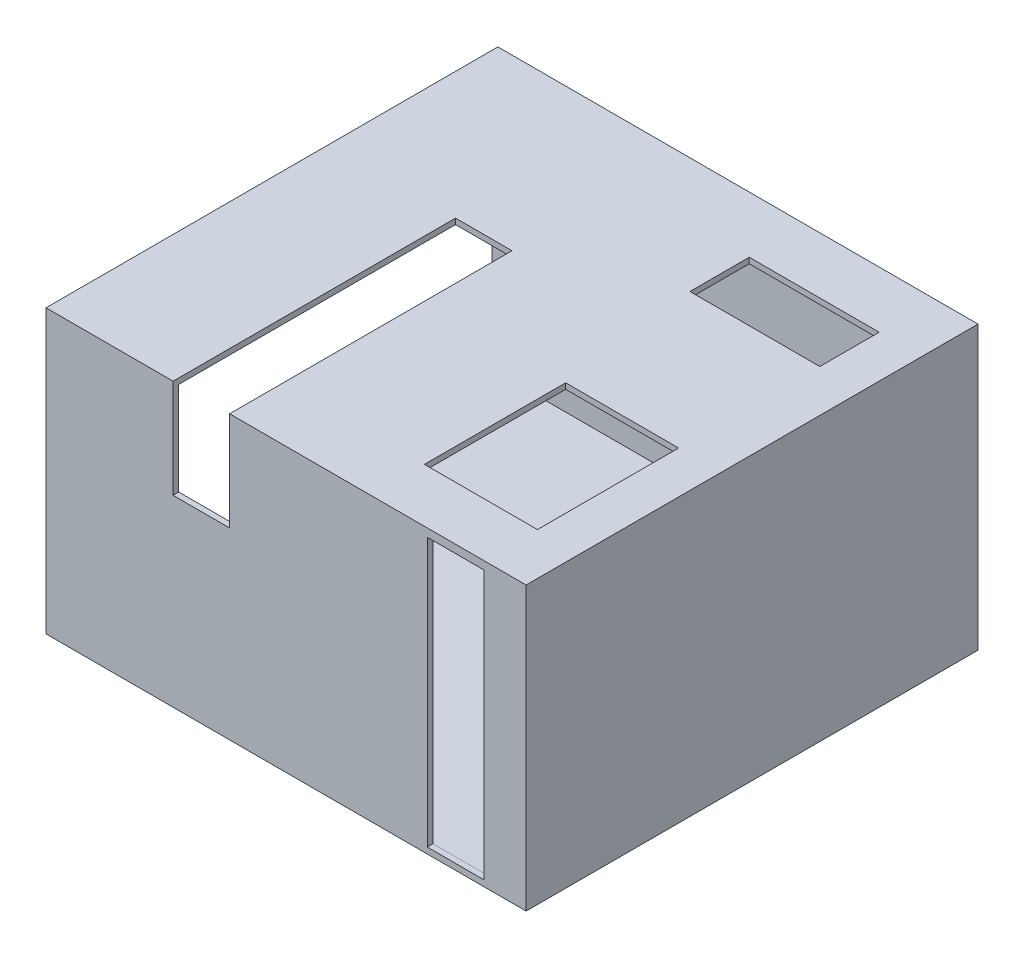
ISO-10303-21;
HEADER;
FILE_DESCRIPTION(('STEP AP214'),'2;1');
FILE_NAME('part.step','',(''),(''),'','','');
FILE_SCHEMA(('AUTOMOTIVE_DESIGN { 1 0 10303 214 1 1 1 1 }'));
ENDSEC;
DATA;
#1=APPLICATION_CONTEXT('core data for automotive mechanical design processes');
#2=APPLICATION_PROTOCOL_DEFINITION('international standard','automotive_design',2000,#1);
#3=PRODUCT_CONTEXT('',#1,'mechanical');
#4=PRODUCT('Part','Part','',(#3));
#5=PRODUCT_RELATED_PRODUCT_CATEGORY('part','',(#4));
#6=PRODUCT_DEFINITION_FORMATION('','',#4);
#7=PRODUCT_DEFINITION_CONTEXT('part definition',#1,'design');
#8=PRODUCT_DEFINITION('design','',#6,#7);
#9=PRODUCT_DEFINITION_SHAPE('','',#8);
#10=(LENGTH_UNIT() NAMED_UNIT(*) SI_UNIT(.MILLI.,.METRE.));
#11=(NAMED_UNIT(*) PLANE_ANGLE_UNIT() SI_UNIT($,.RADIAN.));
#12=(NAMED_UNIT(*) SI_UNIT($,.STERADIAN.) SOLID_ANGLE_UNIT());
#13=UNCERTAINTY_MEASURE_WITH_UNIT(LENGTH_MEASURE(1.E-05),#10,'distance_accuracy_value','');
#14=(GEOMETRIC_REPRESENTATION_CONTEXT(3) GLOBAL_UNCERTAINTY_ASSIGNED_CONTEXT((#13)) GLOBAL_UNIT_ASSIGNED_CONTEXT((#10,
#11,#12)) REPRESENTATION_CONTEXT('',''));
#15=CARTESIAN_POINT('',(0.,0.,0.));
#16=DIRECTION('',(0.,0.,1.));
#17=DIRECTION('',(1.,0.,0.));
#18=AXIS2_PLACEMENT_3D('',#15,#16,#17);
#19=CARTESIAN_POINT('',(132.679929783499,32.3434757167935,160.));
#20=DIRECTION('',(0.,-1.,0.));
#21=DIRECTION('',(1.,0.,0.));
#22=AXIS2_PLACEMENT_3D('',#19,#20,#21);
#23=PLANE('',#22);
#24=DIRECTION('',(1.,0.,0.));
#25=VECTOR('',#24,1.);
#26=CARTESIAN_POINT('',(77.6799297834991,32.3434757167935,141.));
#27=LINE('',#26,#25);
#28=CARTESIAN_POINT('',(77.6799297834991,32.3434757167935,141.));
#29=VERTEX_POINT('',#28);
#30=CARTESIAN_POINT('',(117.679929783499,32.3434757167935,141.));
#31=VERTEX_POINT('',#30);
#32=EDGE_CURVE('E452',#29,#31,#27,.T.);
#33=ORIENTED_EDGE('',*,*,#32,.F.);
#34=DIRECTION('',(0.,0.,1.));
#35=VECTOR('',#34,1.);
#36=CARTESIAN_POINT('',(77.6799297834991,32.3434757167935,91.));
#37=LINE('',#36,#35);
#38=CARTESIAN_POINT('',(77.6799297834991,32.3434757167935,91.));
#39=VERTEX_POINT('',#38);
#40=EDGE_CURVE('E408',#39,#29,#37,.T.);
#41=ORIENTED_EDGE('',*,*,#40,.F.);
#42=DIRECTION('',(-1.,0.,0.));
#43=VECTOR('',#42,1.);
#44=CARTESIAN_POINT('',(77.6799297834991,32.3434757167935,91.));
#45=LINE('',#44,#43);
#46=CARTESIAN_POINT('',(117.679929783499,32.3434757167935,91.));
#47=VERTEX_POINT('',#46);
#48=EDGE_CURVE('E436',#47,#39,#45,.T.);
#49=ORIENTED_EDGE('',*,*,#48,.F.);
#50=DIRECTION('',(0.,0.,-1.));
#51=VECTOR('',#50,1.);
#52=CARTESIAN_POINT('',(117.679929783499,32.3434757167935,91.));
#53=LINE('',#52,#51);
#54=EDGE_CURVE('E448',#31,#47,#53,.T.);
#55=ORIENTED_EDGE('',*,*,#54,.F.);
#56=EDGE_LOOP('',(#33,#41,#49,#55));
#57=FACE_BOUND('',#56,.T.);
#58=DIRECTION('',(1.,0.,0.));
#59=VECTOR('',#58,1.);
#60=CARTESIAN_POINT('',(71.6799297834991,32.3434757167935,41.));
#61=LINE('',#60,#59);
#62=CARTESIAN_POINT('',(71.6799297834991,32.3434757167935,41.));
#63=VERTEX_POINT('',#62);
#64=CARTESIAN_POINT('',(117.679929783499,32.3434757167935,41.));
#65=VERTEX_POINT('',#64);
#66=EDGE_CURVE('E407',#63,#65,#61,.T.);
#67=ORIENTED_EDGE('',*,*,#66,.F.);
#68=DIRECTION('',(0.,0.,1.));
#69=VECTOR('',#68,1.);
#70=CARTESIAN_POINT('',(71.6799297834991,32.3434757167935,20.));
#71=LINE('',#70,#69);
#72=CARTESIAN_POINT('',(71.6799297834991,32.3434757167935,20.));
#73=VERTEX_POINT('',#72);
#74=EDGE_CURVE('E404',#73,#63,#71,.T.);
#75=ORIENTED_EDGE('',*,*,#74,.F.);
#76=DIRECTION('',(-1.,0.,0.));
#77=VECTOR('',#76,1.);
#78=CARTESIAN_POINT('',(71.6799297834991,32.3434757167935,20.));
#79=LINE('',#78,#77);
#80=CARTESIAN_POINT('',(117.679929783499,32.3434757167935,20.));
#81=VERTEX_POINT('',#80);
#82=EDGE_CURVE('E416',#81,#73,#79,.T.);
#83=ORIENTED_EDGE('',*,*,#82,.F.);
#84=DIRECTION('',(0.,0.,-1.));
#85=VECTOR('',#84,1.);
#86=CARTESIAN_POINT('',(117.679929783499,32.3434757167935,20.));
#87=LINE('',#86,#85);
#88=EDGE_CURVE('E412',#65,#81,#87,.T.);
#89=ORIENTED_EDGE('',*,*,#88,.F.);
#90=EDGE_LOOP('',(#67,#75,#83,#89));
#91=FACE_BOUND('',#90,.T.);
#92=DIRECTION('',(0.,0.,-1.));
#93=VECTOR('',#92,1.);
#94=CARTESIAN_POINT('',(-37.320070216501,32.3434757167934,160.));
#95=LINE('',#94,#93);
#96=CARTESIAN_POINT('',(-37.320070216501,32.3434757167934,160.));
#97=VERTEX_POINT('',#96);
#98=CARTESIAN_POINT('',(-37.320070216501,32.3434757167934,0.));
#99=VERTEX_POINT('',#98);
#100=EDGE_CURVE('E62',#97,#99,#95,.T.);
#101=ORIENTED_EDGE('',*,*,#100,.F.);
#102=DIRECTION('',(-1.,0.,0.));
#103=VECTOR('',#102,1.);
#104=CARTESIAN_POINT('',(132.679929783499,32.3434757167935,160.));
#105=LINE('',#104,#103);
#106=CARTESIAN_POINT('',(7.67992978349914,32.3434757167935,160.));
#107=VERTEX_POINT('',#106);
#108=EDGE_CURVE('E263',#107,#97,#105,.T.);
#109=ORIENTED_EDGE('',*,*,#108,.F.);
#110=DIRECTION('',(0.,0.,1.));
#111=VECTOR('',#110,1.);
#112=CARTESIAN_POINT('',(7.67992978349913,32.3434757167935,60.));
#113=LINE('',#112,#111);
#114=CARTESIAN_POINT('',(7.67992978349913,32.3434757167935,60.));
#115=VERTEX_POINT('',#114);
#116=EDGE_CURVE('E479',#115,#107,#113,.T.);
#117=ORIENTED_EDGE('',*,*,#116,.F.);
#118=DIRECTION('',(-1.,0.,0.));
#119=VECTOR('',#118,1.);
#120=CARTESIAN_POINT('',(7.67992978349913,32.3434757167935,60.));
#121=LINE('',#120,#119);
#122=CARTESIAN_POINT('',(27.6799297834991,32.3434757167935,60.));
#123=VERTEX_POINT('',#122);
#124=EDGE_CURVE('E495',#123,#115,#121,.T.);
#125=ORIENTED_EDGE('',*,*,#124,.F.);
#126=DIRECTION('',(0.,0.,-1.));
#127=VECTOR('',#126,1.);
#128=CARTESIAN_POINT('',(27.6799297834991,32.3434757167935,60.));
#129=LINE('',#128,#127);
#130=CARTESIAN_POINT('',(27.6799297834991,32.3434757167935,160.));
#131=VERTEX_POINT('',#130);
#132=EDGE_CURVE('E359',#131,#123,#129,.T.);
#133=ORIENTED_EDGE('',*,*,#132,.F.);
#134=CARTESIAN_POINT('',(132.679929783499,32.3434757167935,160.));
#135=VERTEX_POINT('',#134);
#136=EDGE_CURVE('E265',#135,#131,#105,.T.);
#137=ORIENTED_EDGE('',*,*,#136,.F.);
#138=DIRECTION('',(0.,0.,-1.));
#139=VECTOR('',#138,1.);
#140=CARTESIAN_POINT('',(132.679929783499,32.3434757167935,160.));
#141=LINE('',#140,#139);
#142=CARTESIAN_POINT('',(132.679929783499,32.3434757167935,0.));
#143=VERTEX_POINT('',#142);
#144=EDGE_CURVE('E287',#135,#143,#141,.T.);
#145=ORIENTED_EDGE('',*,*,#144,.T.);
#146=DIRECTION('',(-1.,0.,0.));
#147=VECTOR('',#146,1.);
#148=CARTESIAN_POINT('',(132.679929783499,32.3434757167935,0.));
#149=LINE('',#148,#147);
#150=EDGE_CURVE('E277',#143,#99,#149,.T.);
#151=ORIENTED_EDGE('',*,*,#150,.T.);
#152=EDGE_LOOP('',(#101,#109,#117,#125,#133,#137,#145,#151));
#153=FACE_BOUND('',#152,.T.);
#154=ADVANCED_FACE('F46',(#57,#91,#153),#23,.F.);
#155=CARTESIAN_POINT('',(132.679929783499,-67.6565242832065,160.));
#156=DIRECTION('',(0.,1.,0.));
#157=DIRECTION('',(-1.,0.,0.));
#158=AXIS2_PLACEMENT_3D('',#155,#156,#157);
#159=PLANE('',#158);
#160=DIRECTION('',(0.,0.,1.));
#161=VECTOR('',#160,1.);
#162=CARTESIAN_POINT('',(-37.320070216501,-67.6565242832066,160.));
#163=LINE('',#162,#161);
#164=CARTESIAN_POINT('',(-37.320070216501,-67.6565242832066,0.));
#165=VERTEX_POINT('',#164);
#166=CARTESIAN_POINT('',(-37.320070216501,-67.6565242832066,160.));
#167=VERTEX_POINT('',#166);
#168=EDGE_CURVE('E481',#165,#167,#163,.T.);
#169=ORIENTED_EDGE('',*,*,#168,.F.);
#170=DIRECTION('',(1.,0.,0.));
#171=VECTOR('',#170,1.);
#172=CARTESIAN_POINT('',(132.679929783499,-67.6565242832065,0.));
#173=LINE('',#172,#171);
#174=CARTESIAN_POINT('',(132.679929783499,-67.6565242832065,0.));
#175=VERTEX_POINT('',#174);
#176=EDGE_CURVE('E264',#165,#175,#173,.T.);
#177=ORIENTED_EDGE('',*,*,#176,.T.);
#178=DIRECTION('',(0.,0.,-1.));
#179=VECTOR('',#178,1.);
#180=CARTESIAN_POINT('',(132.679929783499,-67.6565242832065,160.));
#181=LINE('',#180,#179);
#182=CARTESIAN_POINT('',(132.679929783499,-67.6565242832065,160.));
#183=VERTEX_POINT('',#182);
#184=EDGE_CURVE('E272',#183,#175,#181,.T.);
#185=ORIENTED_EDGE('',*,*,#184,.F.);
#186=DIRECTION('',(1.,0.,0.));
#187=VECTOR('',#186,1.);
#188=CARTESIAN_POINT('',(132.679929783499,-67.6565242832065,160.));
#189=LINE('',#188,#187);
#190=EDGE_CURVE('E269',#167,#183,#189,.T.);
#191=ORIENTED_EDGE('',*,*,#190,.F.);
#192=EDGE_LOOP('',(#169,#177,#185,#191));
#193=FACE_BOUND('',#192,.T.);
#194=ADVANCED_FACE('F547',(#193),#159,.F.);
#195=CARTESIAN_POINT('',(0.,0.,160.));
#196=DIRECTION('',(0.,0.,1.));
#197=DIRECTION('',(1.,0.,0.));
#198=AXIS2_PLACEMENT_3D('',#195,#196,#197);
#199=PLANE('',#198);
#200=DIRECTION('',(0.,-1.,0.));
#201=VECTOR('',#200,1.);
#202=CARTESIAN_POINT('',(97.6799297834991,29.4878306482134,160.));
#203=LINE('',#202,#201);
#204=CARTESIAN_POINT('',(97.6799297834991,29.4878306482134,160.));
#205=VERTEX_POINT('',#204);
#206=CARTESIAN_POINT('',(97.6799297834991,-65.5121693517866,160.));
#207=VERTEX_POINT('',#206);
#208=EDGE_CURVE('E369',#205,#207,#203,.T.);
#209=ORIENTED_EDGE('',*,*,#208,.F.);
#210=DIRECTION('',(-1.,0.,0.));
#211=VECTOR('',#210,1.);
#212=CARTESIAN_POINT('',(97.6799297834991,29.4878306482134,160.));
#213=LINE('',#212,#211);
#214=CARTESIAN_POINT('',(117.679929783499,29.4878306482134,160.));
#215=VERTEX_POINT('',#214);
#216=EDGE_CURVE('E386',#215,#205,#213,.T.);
#217=ORIENTED_EDGE('',*,*,#216,.F.);
#218=DIRECTION('',(0.,1.,0.));
#219=VECTOR('',#218,1.);
#220=CARTESIAN_POINT('',(117.679929783499,29.4878306482134,160.));
#221=LINE('',#220,#219);
#222=CARTESIAN_POINT('',(117.679929783499,-65.5121693517866,160.));
#223=VERTEX_POINT('',#222);
#224=EDGE_CURVE('E382',#223,#215,#221,.T.);
#225=ORIENTED_EDGE('',*,*,#224,.F.);
#226=DIRECTION('',(1.,0.,0.));
#227=VECTOR('',#226,1.);
#228=CARTESIAN_POINT('',(97.6799297834991,-65.5121693517866,160.));
#229=LINE('',#228,#227);
#230=EDGE_CURVE('E378',#207,#223,#229,.T.);
#231=ORIENTED_EDGE('',*,*,#230,.F.);
#232=EDGE_LOOP('',(#209,#217,#225,#231));
#233=FACE_BOUND('',#232,.T.);
#234=ORIENTED_EDGE('',*,*,#108,.T.);
#235=DIRECTION('',(0.,-1.,0.));
#236=VECTOR('',#235,1.);
#237=CARTESIAN_POINT('',(-37.320070216501,0.,160.));
#238=LINE('',#237,#236);
#239=EDGE_CURVE('E474',#97,#167,#238,.T.);
#240=ORIENTED_EDGE('',*,*,#239,.T.);
#241=ORIENTED_EDGE('',*,*,#190,.T.);
#242=DIRECTION('',(0.,1.,0.));
#243=VECTOR('',#242,1.);
#244=CARTESIAN_POINT('',(132.679929783499,-67.6565242832065,160.));
#245=LINE('',#244,#243);
#246=EDGE_CURVE('E259',#183,#135,#245,.T.);
#247=ORIENTED_EDGE('',*,*,#246,.T.);
#248=ORIENTED_EDGE('',*,*,#136,.T.);
#249=DIRECTION('',(0.,1.,0.));
#250=VECTOR('',#249,1.);
#251=CARTESIAN_POINT('',(27.6799297834991,-2.65652428320655,160.));
#252=LINE('',#251,#250);
#253=CARTESIAN_POINT('',(27.6799297834991,-2.65652428320655,160.));
#254=VERTEX_POINT('',#253);
#255=EDGE_CURVE('E362',#254,#131,#252,.T.);
#256=ORIENTED_EDGE('',*,*,#255,.F.);
#257=DIRECTION('',(1.,0.,0.));
#258=VECTOR('',#257,1.);
#259=CARTESIAN_POINT('',(7.67992978349914,-2.65652428320655,160.));
#260=LINE('',#259,#258);
#261=CARTESIAN_POINT('',(7.67992978349913,-2.65652428320655,160.));
#262=VERTEX_POINT('',#261);
#263=EDGE_CURVE('E494',#262,#254,#260,.T.);
#264=ORIENTED_EDGE('',*,*,#263,.F.);
#265=DIRECTION('',(0.,1.,0.));
#266=VECTOR('',#265,1.);
#267=CARTESIAN_POINT('',(7.67992978349914,-2.65652428320655,160.));
#268=LINE('',#267,#266);
#269=EDGE_CURVE('E373',#262,#107,#268,.T.);
#270=ORIENTED_EDGE('',*,*,#269,.T.);
#271=EDGE_LOOP('',(#234,#240,#241,#247,#248,#256,#264,#270));
#272=FACE_BOUND('',#271,.T.);
#273=ADVANCED_FACE('F473',(#233,#272),#199,.T.);
#274=CARTESIAN_POINT('',(0.,0.,0.));
#275=DIRECTION('',(0.,0.,1.));
#276=DIRECTION('',(1.,0.,0.));
#277=AXIS2_PLACEMENT_3D('',#274,#275,#276);
#278=PLANE('',#277);
#279=DIRECTION('',(0.,-1.,0.));
#280=VECTOR('',#279,1.);
#281=CARTESIAN_POINT('',(-37.320070216501,0.,0.));
#282=LINE('',#281,#280);
#283=EDGE_CURVE('E486',#99,#165,#282,.T.);
#284=ORIENTED_EDGE('',*,*,#283,.F.);
#285=ORIENTED_EDGE('',*,*,#150,.F.);
#286=DIRECTION('',(0.,1.,0.));
#287=VECTOR('',#286,1.);
#288=CARTESIAN_POINT('',(132.679929783499,-67.6565242832065,0.));
#289=LINE('',#288,#287);
#290=EDGE_CURVE('E273',#175,#143,#289,.T.);
#291=ORIENTED_EDGE('',*,*,#290,.F.);
#292=ORIENTED_EDGE('',*,*,#176,.F.);
#293=EDGE_LOOP('',(#284,#285,#291,#292));
#294=FACE_BOUND('',#293,.T.);
#295=ADVANCED_FACE('F517',(#294),#278,.F.);
#296=CARTESIAN_POINT('',(132.679929783499,30.3434757167935,160.));
#297=DIRECTION('',(0.,-1.,0.));
#298=DIRECTION('',(1.,0.,0.));
#299=AXIS2_PLACEMENT_3D('',#296,#297,#298);
#300=PLANE('',#299);
#301=DIRECTION('',(0.,0.,-1.));
#302=VECTOR('',#301,1.);
#303=CARTESIAN_POINT('',(71.6799297834991,30.3434757167935,160.));
#304=LINE('',#303,#302);
#305=CARTESIAN_POINT('',(71.6799297834991,30.3434757167935,41.));
#306=VERTEX_POINT('',#305);
#307=CARTESIAN_POINT('',(71.6799297834991,30.3434757167935,20.));
#308=VERTEX_POINT('',#307);
#309=EDGE_CURVE('E314',#306,#308,#304,.T.);
#310=ORIENTED_EDGE('',*,*,#309,.F.);
#311=DIRECTION('',(-1.,0.,0.));
#312=VECTOR('',#311,1.);
#313=CARTESIAN_POINT('',(132.679929783499,30.3434757167935,41.));
#314=LINE('',#313,#312);
#315=CARTESIAN_POINT('',(117.679929783499,30.3434757167935,41.));
#316=VERTEX_POINT('',#315);
#317=EDGE_CURVE('E304',#316,#306,#314,.T.);
#318=ORIENTED_EDGE('',*,*,#317,.F.);
#319=DIRECTION('',(0.,0.,1.));
#320=VECTOR('',#319,1.);
#321=CARTESIAN_POINT('',(117.679929783499,30.3434757167935,160.));
#322=LINE('',#321,#320);
#323=CARTESIAN_POINT('',(117.679929783499,30.3434757167935,20.));
#324=VERTEX_POINT('',#323);
#325=EDGE_CURVE('E307',#324,#316,#322,.T.);
#326=ORIENTED_EDGE('',*,*,#325,.F.);
#327=DIRECTION('',(1.,0.,0.));
#328=VECTOR('',#327,1.);
#329=CARTESIAN_POINT('',(132.679929783499,30.3434757167935,20.));
#330=LINE('',#329,#328);
#331=EDGE_CURVE('E311',#308,#324,#330,.T.);
#332=ORIENTED_EDGE('',*,*,#331,.F.);
#333=EDGE_LOOP('',(#310,#318,#326,#332));
#334=FACE_BOUND('',#333,.T.);
#335=DIRECTION('',(0.,0.,-1.));
#336=VECTOR('',#335,1.);
#337=CARTESIAN_POINT('',(77.6799297834991,30.3434757167935,160.));
#338=LINE('',#337,#336);
#339=CARTESIAN_POINT('',(77.6799297834991,30.3434757167935,141.));
#340=VERTEX_POINT('',#339);
#341=CARTESIAN_POINT('',(77.6799297834991,30.3434757167935,91.));
#342=VERTEX_POINT('',#341);
#343=EDGE_CURVE('E301',#340,#342,#338,.T.);
#344=ORIENTED_EDGE('',*,*,#343,.F.);
#345=DIRECTION('',(-1.,0.,0.));
#346=VECTOR('',#345,1.);
#347=CARTESIAN_POINT('',(132.679929783499,30.3434757167935,141.));
#348=LINE('',#347,#346);
#349=CARTESIAN_POINT('',(117.679929783499,30.3434757167935,141.));
#350=VERTEX_POINT('',#349);
#351=EDGE_CURVE('E291',#350,#340,#348,.T.);
#352=ORIENTED_EDGE('',*,*,#351,.F.);
#353=DIRECTION('',(0.,0.,1.));
#354=VECTOR('',#353,1.);
#355=CARTESIAN_POINT('',(117.679929783499,30.3434757167935,160.));
#356=LINE('',#355,#354);
#357=CARTESIAN_POINT('',(117.679929783499,30.3434757167935,91.));
#358=VERTEX_POINT('',#357);
#359=EDGE_CURVE('E294',#358,#350,#356,.T.);
#360=ORIENTED_EDGE('',*,*,#359,.F.);
#361=DIRECTION('',(1.,0.,0.));
#362=VECTOR('',#361,1.);
#363=CARTESIAN_POINT('',(132.679929783499,30.3434757167935,91.));
#364=LINE('',#363,#362);
#365=EDGE_CURVE('E298',#342,#358,#364,.T.);
#366=ORIENTED_EDGE('',*,*,#365,.F.);
#367=EDGE_LOOP('',(#344,#352,#360,#366));
#368=FACE_BOUND('',#367,.T.);
#369=DIRECTION('',(-1.,0.,0.));
#370=VECTOR('',#369,1.);
#371=CARTESIAN_POINT('',(132.679929783499,30.3434757167935,158.));
#372=LINE('',#371,#370);
#373=CARTESIAN_POINT('',(7.67992978349914,30.3434757167935,158.));
#374=VERTEX_POINT('',#373);
#375=CARTESIAN_POINT('',(-37.320070216501,30.3434757167934,158.));
#376=VERTEX_POINT('',#375);
#377=EDGE_CURVE('E231',#374,#376,#372,.T.);
#378=ORIENTED_EDGE('',*,*,#377,.T.);
#379=DIRECTION('',(0.,0.,-1.));
#380=VECTOR('',#379,1.);
#381=CARTESIAN_POINT('',(-37.320070216501,30.3434757167934,160.));
#382=LINE('',#381,#380);
#383=CARTESIAN_POINT('',(-37.320070216501,30.3434757167935,2.));
#384=VERTEX_POINT('',#383);
#385=EDGE_CURVE('E218',#376,#384,#382,.T.);
#386=ORIENTED_EDGE('',*,*,#385,.T.);
#387=DIRECTION('',(-1.,0.,0.));
#388=VECTOR('',#387,1.);
#389=CARTESIAN_POINT('',(132.679929783499,30.3434757167935,2.));
#390=LINE('',#389,#388);
#391=CARTESIAN_POINT('',(130.679929783499,30.3434757167935,2.));
#392=VERTEX_POINT('',#391);
#393=EDGE_CURVE('E227',#392,#384,#390,.T.);
#394=ORIENTED_EDGE('',*,*,#393,.F.);
#395=DIRECTION('',(0.,0.,-1.));
#396=VECTOR('',#395,1.);
#397=CARTESIAN_POINT('',(130.679929783499,30.3434757167935,160.));
#398=LINE('',#397,#396);
#399=CARTESIAN_POINT('',(130.679929783499,30.3434757167935,158.));
#400=VERTEX_POINT('',#399);
#401=EDGE_CURVE('E278',#400,#392,#398,.T.);
#402=ORIENTED_EDGE('',*,*,#401,.F.);
#403=CARTESIAN_POINT('',(27.6799297834991,30.3434757167935,158.));
#404=VERTEX_POINT('',#403);
#405=EDGE_CURVE('E252',#400,#404,#372,.T.);
#406=ORIENTED_EDGE('',*,*,#405,.T.);
#407=DIRECTION('',(0.,0.,1.));
#408=VECTOR('',#407,1.);
#409=CARTESIAN_POINT('',(27.6799297834991,30.3434757167935,160.));
#410=LINE('',#409,#408);
#411=CARTESIAN_POINT('',(27.6799297834991,30.3434757167935,60.));
#412=VERTEX_POINT('',#411);
#413=EDGE_CURVE('E357',#412,#404,#410,.T.);
#414=ORIENTED_EDGE('',*,*,#413,.F.);
#415=DIRECTION('',(1.,0.,0.));
#416=VECTOR('',#415,1.);
#417=CARTESIAN_POINT('',(132.679929783499,30.3434757167935,60.));
#418=LINE('',#417,#416);
#419=CARTESIAN_POINT('',(7.67992978349913,30.3434757167935,60.));
#420=VERTEX_POINT('',#419);
#421=EDGE_CURVE('E55',#420,#412,#418,.T.);
#422=ORIENTED_EDGE('',*,*,#421,.F.);
#423=DIRECTION('',(0.,0.,-1.));
#424=VECTOR('',#423,1.);
#425=CARTESIAN_POINT('',(7.67992978349914,30.3434757167935,160.));
#426=LINE('',#425,#424);
#427=EDGE_CURVE('E365',#374,#420,#426,.T.);
#428=ORIENTED_EDGE('',*,*,#427,.F.);
#429=EDGE_LOOP('',(#378,#386,#394,#402,#406,#414,#422,#428));
#430=FACE_BOUND('',#429,.T.);
#431=ADVANCED_FACE('F225',(#334,#368,#430),#300,.T.);
#432=CARTESIAN_POINT('',(132.679929783499,-65.6565242832065,160.));
#433=DIRECTION('',(0.,1.,0.));
#434=DIRECTION('',(-1.,0.,0.));
#435=AXIS2_PLACEMENT_3D('',#432,#433,#434);
#436=PLANE('',#435);
#437=DIRECTION('',(1.,0.,0.));
#438=VECTOR('',#437,1.);
#439=CARTESIAN_POINT('',(132.679929783499,-65.6565242832065,2.));
#440=LINE('',#439,#438);
#441=CARTESIAN_POINT('',(-37.320070216501,-65.6565242832066,2.));
#442=VERTEX_POINT('',#441);
#443=CARTESIAN_POINT('',(130.679929783499,-65.6565242832065,2.));
#444=VERTEX_POINT('',#443);
#445=EDGE_CURVE('E240',#442,#444,#440,.T.);
#446=ORIENTED_EDGE('',*,*,#445,.F.);
#447=DIRECTION('',(0.,0.,1.));
#448=VECTOR('',#447,1.);
#449=CARTESIAN_POINT('',(-37.320070216501,-65.6565242832066,160.));
#450=LINE('',#449,#448);
#451=CARTESIAN_POINT('',(-37.320070216501,-65.6565242832066,158.));
#452=VERTEX_POINT('',#451);
#453=EDGE_CURVE('E70',#442,#452,#450,.T.);
#454=ORIENTED_EDGE('',*,*,#453,.T.);
#455=DIRECTION('',(1.,0.,0.));
#456=VECTOR('',#455,1.);
#457=CARTESIAN_POINT('',(132.679929783499,-65.6565242832065,158.));
#458=LINE('',#457,#456);
#459=CARTESIAN_POINT('',(130.679929783499,-65.6565242832065,158.));
#460=VERTEX_POINT('',#459);
#461=EDGE_CURVE('E256',#452,#460,#458,.T.);
#462=ORIENTED_EDGE('',*,*,#461,.T.);
#463=DIRECTION('',(0.,0.,-1.));
#464=VECTOR('',#463,1.);
#465=CARTESIAN_POINT('',(130.679929783499,-65.6565242832065,160.));
#466=LINE('',#465,#464);
#467=EDGE_CURVE('E250',#460,#444,#466,.T.);
#468=ORIENTED_EDGE('',*,*,#467,.T.);
#469=EDGE_LOOP('',(#446,#454,#462,#468));
#470=FACE_BOUND('',#469,.T.);
#471=ADVANCED_FACE('F526',(#470),#436,.T.);
#472=CARTESIAN_POINT('',(0.,0.,158.));
#473=DIRECTION('',(0.,0.,1.));
#474=DIRECTION('',(1.,0.,0.));
#475=AXIS2_PLACEMENT_3D('',#472,#473,#474);
#476=PLANE('',#475);
#477=DIRECTION('',(-1.,0.,0.));
#478=VECTOR('',#477,1.);
#479=CARTESIAN_POINT('',(0.,29.4878306482134,158.));
#480=LINE('',#479,#478);
#481=CARTESIAN_POINT('',(117.679929783499,29.4878306482134,158.));
#482=VERTEX_POINT('',#481);
#483=CARTESIAN_POINT('',(97.6799297834991,29.4878306482134,158.));
#484=VERTEX_POINT('',#483);
#485=EDGE_CURVE('E325',#482,#484,#480,.T.);
#486=ORIENTED_EDGE('',*,*,#485,.T.);
#487=DIRECTION('',(0.,-1.,0.));
#488=VECTOR('',#487,1.);
#489=CARTESIAN_POINT('',(97.6799297834991,0.,158.));
#490=LINE('',#489,#488);
#491=CARTESIAN_POINT('',(97.6799297834991,-65.5121693517866,158.));
#492=VERTEX_POINT('',#491);
#493=EDGE_CURVE('E329',#484,#492,#490,.T.);
#494=ORIENTED_EDGE('',*,*,#493,.T.);
#495=DIRECTION('',(1.,0.,0.));
#496=VECTOR('',#495,1.);
#497=CARTESIAN_POINT('',(0.,-65.5121693517866,158.));
#498=LINE('',#497,#496);
#499=CARTESIAN_POINT('',(117.679929783499,-65.5121693517866,158.));
#500=VERTEX_POINT('',#499);
#501=EDGE_CURVE('E317',#492,#500,#498,.T.);
#502=ORIENTED_EDGE('',*,*,#501,.T.);
#503=DIRECTION('',(0.,1.,0.));
#504=VECTOR('',#503,1.);
#505=CARTESIAN_POINT('',(117.679929783499,0.,158.));
#506=LINE('',#505,#504);
#507=EDGE_CURVE('E321',#500,#482,#506,.T.);
#508=ORIENTED_EDGE('',*,*,#507,.T.);
#509=EDGE_LOOP('',(#486,#494,#502,#508));
#510=FACE_BOUND('',#509,.T.);
#511=DIRECTION('',(0.,-1.,0.));
#512=VECTOR('',#511,1.);
#513=CARTESIAN_POINT('',(-37.320070216501,0.,158.));
#514=LINE('',#513,#512);
#515=EDGE_CURVE('E233',#376,#452,#514,.T.);
#516=ORIENTED_EDGE('',*,*,#515,.F.);
#517=ORIENTED_EDGE('',*,*,#377,.F.);
#518=DIRECTION('',(0.,-1.,0.));
#519=VECTOR('',#518,1.);
#520=CARTESIAN_POINT('',(7.67992978349914,0.,158.));
#521=LINE('',#520,#519);
#522=CARTESIAN_POINT('',(7.67992978349914,-2.65652428320655,158.));
#523=VERTEX_POINT('',#522);
#524=EDGE_CURVE('E340',#374,#523,#521,.T.);
#525=ORIENTED_EDGE('',*,*,#524,.T.);
#526=DIRECTION('',(-1.,0.,0.));
#527=VECTOR('',#526,1.);
#528=CARTESIAN_POINT('',(0.,-2.65652428320655,158.));
#529=LINE('',#528,#527);
#530=CARTESIAN_POINT('',(27.6799297834991,-2.65652428320655,158.));
#531=VERTEX_POINT('',#530);
#532=EDGE_CURVE('E333',#531,#523,#529,.T.);
#533=ORIENTED_EDGE('',*,*,#532,.F.);
#534=DIRECTION('',(0.,1.,0.));
#535=VECTOR('',#534,1.);
#536=CARTESIAN_POINT('',(27.6799297834991,0.,158.));
#537=LINE('',#536,#535);
#538=EDGE_CURVE('E336',#531,#404,#537,.T.);
#539=ORIENTED_EDGE('',*,*,#538,.T.);
#540=ORIENTED_EDGE('',*,*,#405,.F.);
#541=DIRECTION('',(0.,1.,0.));
#542=VECTOR('',#541,1.);
#543=CARTESIAN_POINT('',(130.679929783499,-67.6565242832065,158.));
#544=LINE('',#543,#542);
#545=EDGE_CURVE('E244',#460,#400,#544,.T.);
#546=ORIENTED_EDGE('',*,*,#545,.F.);
#547=ORIENTED_EDGE('',*,*,#461,.F.);
#548=EDGE_LOOP('',(#516,#517,#525,#533,#539,#540,#546,#547));
#549=FACE_BOUND('',#548,.T.);
#550=ADVANCED_FACE('F528',(#510,#549),#476,.F.);
#551=CARTESIAN_POINT('',(0.,0.,2.));
#552=DIRECTION('',(0.,0.,1.));
#553=DIRECTION('',(1.,0.,0.));
#554=AXIS2_PLACEMENT_3D('',#551,#552,#553);
#555=PLANE('',#554);
#556=ORIENTED_EDGE('',*,*,#393,.T.);
#557=DIRECTION('',(0.,-1.,0.));
#558=VECTOR('',#557,1.);
#559=CARTESIAN_POINT('',(-37.320070216501,0.,2.));
#560=LINE('',#559,#558);
#561=EDGE_CURVE('E11',#384,#442,#560,.T.);
#562=ORIENTED_EDGE('',*,*,#561,.T.);
#563=ORIENTED_EDGE('',*,*,#445,.T.);
#564=DIRECTION('',(0.,1.,0.));
#565=VECTOR('',#564,1.);
#566=CARTESIAN_POINT('',(130.679929783499,-67.6565242832065,2.));
#567=LINE('',#566,#565);
#568=EDGE_CURVE('E238',#444,#392,#567,.T.);
#569=ORIENTED_EDGE('',*,*,#568,.T.);
#570=EDGE_LOOP('',(#556,#562,#563,#569));
#571=FACE_BOUND('',#570,.T.);
#572=ADVANCED_FACE('F236',(#571),#555,.T.);
#573=CARTESIAN_POINT('',(132.679929783499,-67.6565242832065,160.));
#574=DIRECTION('',(-1.,0.,0.));
#575=DIRECTION('',(0.,0.,1.));
#576=AXIS2_PLACEMENT_3D('',#573,#574,#575);
#577=PLANE('',#576);
#578=ORIENTED_EDGE('',*,*,#290,.T.);
#579=ORIENTED_EDGE('',*,*,#144,.F.);
#580=ORIENTED_EDGE('',*,*,#246,.F.);
#581=ORIENTED_EDGE('',*,*,#184,.T.);
#582=EDGE_LOOP('',(#578,#579,#580,#581));
#583=FACE_BOUND('',#582,.T.);
#584=ADVANCED_FACE('F48',(#583),#577,.F.);
#585=CARTESIAN_POINT('',(130.679929783499,-67.6565242832065,160.));
#586=DIRECTION('',(-1.,0.,0.));
#587=DIRECTION('',(0.,0.,1.));
#588=AXIS2_PLACEMENT_3D('',#585,#586,#587);
#589=PLANE('',#588);
#590=ORIENTED_EDGE('',*,*,#568,.F.);
#591=ORIENTED_EDGE('',*,*,#467,.F.);
#592=ORIENTED_EDGE('',*,*,#545,.T.);
#593=ORIENTED_EDGE('',*,*,#401,.T.);
#594=EDGE_LOOP('',(#590,#591,#592,#593));
#595=FACE_BOUND('',#594,.T.);
#596=ADVANCED_FACE('F572',(#595),#589,.T.);
#597=CARTESIAN_POINT('',(77.6799297834991,-35.6565242832065,91.));
#598=DIRECTION('',(-1.,0.,0.));
#599=DIRECTION('',(0.,-1.,0.));
#600=AXIS2_PLACEMENT_3D('',#597,#598,#599);
#601=PLANE('',#600);
#602=ORIENTED_EDGE('',*,*,#343,.T.);
#603=DIRECTION('',(0.,1.,0.));
#604=VECTOR('',#603,1.);
#605=CARTESIAN_POINT('',(77.6799297834991,-35.6565242832065,91.));
#606=LINE('',#605,#604);
#607=EDGE_CURVE('E394',#342,#39,#606,.T.);
#608=ORIENTED_EDGE('',*,*,#607,.T.);
#609=ORIENTED_EDGE('',*,*,#40,.T.);
#610=DIRECTION('',(0.,1.,0.));
#611=VECTOR('',#610,1.);
#612=CARTESIAN_POINT('',(77.6799297834991,-35.6565242832065,141.));
#613=LINE('',#612,#611);
#614=EDGE_CURVE('E432',#340,#29,#613,.T.);
#615=ORIENTED_EDGE('',*,*,#614,.F.);
#616=EDGE_LOOP('',(#602,#608,#609,#615));
#617=FACE_BOUND('',#616,.T.);
#618=ADVANCED_FACE('F575',(#617),#601,.F.);
#619=CARTESIAN_POINT('',(77.6799297834991,-35.6565242832065,91.));
#620=DIRECTION('',(0.,0.,-1.));
#621=DIRECTION('',(-1.,0.,0.));
#622=AXIS2_PLACEMENT_3D('',#619,#620,#621);
#623=PLANE('',#622);
#624=ORIENTED_EDGE('',*,*,#365,.T.);
#625=DIRECTION('',(0.,1.,0.));
#626=VECTOR('',#625,1.);
#627=CARTESIAN_POINT('',(117.679929783499,-35.6565242832065,91.));
#628=LINE('',#627,#626);
#629=EDGE_CURVE('E440',#358,#47,#628,.T.);
#630=ORIENTED_EDGE('',*,*,#629,.T.);
#631=ORIENTED_EDGE('',*,*,#48,.T.);
#632=ORIENTED_EDGE('',*,*,#607,.F.);
#633=EDGE_LOOP('',(#624,#630,#631,#632));
#634=FACE_BOUND('',#633,.T.);
#635=ADVANCED_FACE('F576',(#634),#623,.F.);
#636=CARTESIAN_POINT('',(117.679929783499,-35.6565242832065,91.));
#637=DIRECTION('',(1.,0.,0.));
#638=DIRECTION('',(0.,1.,0.));
#639=AXIS2_PLACEMENT_3D('',#636,#637,#638);
#640=PLANE('',#639);
#641=ORIENTED_EDGE('',*,*,#359,.T.);
#642=DIRECTION('',(0.,1.,0.));
#643=VECTOR('',#642,1.);
#644=CARTESIAN_POINT('',(117.679929783499,-35.6565242832065,141.));
#645=LINE('',#644,#643);
#646=EDGE_CURVE('E437',#350,#31,#645,.T.);
#647=ORIENTED_EDGE('',*,*,#646,.T.);
#648=ORIENTED_EDGE('',*,*,#54,.T.);
#649=ORIENTED_EDGE('',*,*,#629,.F.);
#650=EDGE_LOOP('',(#641,#647,#648,#649));
#651=FACE_BOUND('',#650,.T.);
#652=ADVANCED_FACE('F579',(#651),#640,.F.);
#653=CARTESIAN_POINT('',(77.6799297834991,-35.6565242832065,141.));
#654=DIRECTION('',(0.,0.,1.));
#655=DIRECTION('',(1.,0.,0.));
#656=AXIS2_PLACEMENT_3D('',#653,#654,#655);
#657=PLANE('',#656);
#658=ORIENTED_EDGE('',*,*,#351,.T.);
#659=ORIENTED_EDGE('',*,*,#614,.T.);
#660=ORIENTED_EDGE('',*,*,#32,.T.);
#661=ORIENTED_EDGE('',*,*,#646,.F.);
#662=EDGE_LOOP('',(#658,#659,#660,#661));
#663=FACE_BOUND('',#662,.T.);
#664=ADVANCED_FACE('F583',(#663),#657,.F.);
#665=CARTESIAN_POINT('',(71.6799297834991,-35.6565242832065,20.));
#666=DIRECTION('',(-1.,0.,0.));
#667=DIRECTION('',(0.,-1.,0.));
#668=AXIS2_PLACEMENT_3D('',#665,#666,#667);
#669=PLANE('',#668);
#670=ORIENTED_EDGE('',*,*,#309,.T.);
#671=DIRECTION('',(0.,1.,0.));
#672=VECTOR('',#671,1.);
#673=CARTESIAN_POINT('',(71.6799297834991,-35.6565242832065,20.));
#674=LINE('',#673,#672);
#675=EDGE_CURVE('E246',#308,#73,#674,.T.);
#676=ORIENTED_EDGE('',*,*,#675,.T.);
#677=ORIENTED_EDGE('',*,*,#74,.T.);
#678=DIRECTION('',(0.,1.,0.));
#679=VECTOR('',#678,1.);
#680=CARTESIAN_POINT('',(71.6799297834991,-35.6565242832065,41.));
#681=LINE('',#680,#679);
#682=EDGE_CURVE('E420',#306,#63,#681,.T.);
#683=ORIENTED_EDGE('',*,*,#682,.F.);
#684=EDGE_LOOP('',(#670,#676,#677,#683));
#685=FACE_BOUND('',#684,.T.);
#686=ADVANCED_FACE('F587',(#685),#669,.F.);
#687=CARTESIAN_POINT('',(71.6799297834991,-35.6565242832065,20.));
#688=DIRECTION('',(0.,0.,-1.));
#689=DIRECTION('',(-1.,0.,0.));
#690=AXIS2_PLACEMENT_3D('',#687,#688,#689);
#691=PLANE('',#690);
#692=ORIENTED_EDGE('',*,*,#331,.T.);
#693=DIRECTION('',(0.,1.,0.));
#694=VECTOR('',#693,1.);
#695=CARTESIAN_POINT('',(117.679929783499,-35.6565242832065,20.));
#696=LINE('',#695,#694);
#697=EDGE_CURVE('E423',#324,#81,#696,.T.);
#698=ORIENTED_EDGE('',*,*,#697,.T.);
#699=ORIENTED_EDGE('',*,*,#82,.T.);
#700=ORIENTED_EDGE('',*,*,#675,.F.);
#701=EDGE_LOOP('',(#692,#698,#699,#700));
#702=FACE_BOUND('',#701,.T.);
#703=ADVANCED_FACE('F594',(#702),#691,.F.);
#704=CARTESIAN_POINT('',(117.679929783499,-35.6565242832065,20.));
#705=DIRECTION('',(1.,0.,0.));
#706=DIRECTION('',(0.,1.,0.));
#707=AXIS2_PLACEMENT_3D('',#704,#705,#706);
#708=PLANE('',#707);
#709=ORIENTED_EDGE('',*,*,#325,.T.);
#710=DIRECTION('',(0.,1.,0.));
#711=VECTOR('',#710,1.);
#712=CARTESIAN_POINT('',(117.679929783499,-35.6565242832065,41.));
#713=LINE('',#712,#711);
#714=EDGE_CURVE('E426',#316,#65,#713,.T.);
#715=ORIENTED_EDGE('',*,*,#714,.T.);
#716=ORIENTED_EDGE('',*,*,#88,.T.);
#717=ORIENTED_EDGE('',*,*,#697,.F.);
#718=EDGE_LOOP('',(#709,#715,#716,#717));
#719=FACE_BOUND('',#718,.T.);
#720=ADVANCED_FACE('F600',(#719),#708,.F.);
#721=CARTESIAN_POINT('',(71.6799297834991,-35.6565242832065,41.));
#722=DIRECTION('',(0.,0.,1.));
#723=DIRECTION('',(1.,0.,0.));
#724=AXIS2_PLACEMENT_3D('',#721,#722,#723);
#725=PLANE('',#724);
#726=ORIENTED_EDGE('',*,*,#317,.T.);
#727=ORIENTED_EDGE('',*,*,#682,.T.);
#728=ORIENTED_EDGE('',*,*,#66,.T.);
#729=ORIENTED_EDGE('',*,*,#714,.F.);
#730=EDGE_LOOP('',(#726,#727,#728,#729));
#731=FACE_BOUND('',#730,.T.);
#732=ADVANCED_FACE('F596',(#731),#725,.F.);
#733=CARTESIAN_POINT('',(97.6799297834991,29.4878306482134,142.));
#734=DIRECTION('',(-1.,0.,0.));
#735=DIRECTION('',(0.,-1.,0.));
#736=AXIS2_PLACEMENT_3D('',#733,#734,#735);
#737=PLANE('',#736);
#738=DIRECTION('',(0.,0.,1.));
#739=VECTOR('',#738,1.);
#740=CARTESIAN_POINT('',(97.6799297834991,29.4878306482134,142.));
#741=LINE('',#740,#739);
#742=EDGE_CURVE('E391',#484,#205,#741,.T.);
#743=ORIENTED_EDGE('',*,*,#742,.T.);
#744=ORIENTED_EDGE('',*,*,#208,.T.);
#745=DIRECTION('',(0.,0.,1.));
#746=VECTOR('',#745,1.);
#747=CARTESIAN_POINT('',(97.6799297834991,-65.5121693517866,142.));
#748=LINE('',#747,#746);
#749=EDGE_CURVE('E390',#492,#207,#748,.T.);
#750=ORIENTED_EDGE('',*,*,#749,.F.);
#751=ORIENTED_EDGE('',*,*,#493,.F.);
#752=EDGE_LOOP('',(#743,#744,#750,#751));
#753=FACE_BOUND('',#752,.T.);
#754=ADVANCED_FACE('F599',(#753),#737,.F.);
#755=CARTESIAN_POINT('',(97.6799297834991,29.4878306482134,142.));
#756=DIRECTION('',(0.,1.,0.));
#757=DIRECTION('',(0.,0.,1.));
#758=AXIS2_PLACEMENT_3D('',#755,#756,#757);
#759=PLANE('',#758);
#760=DIRECTION('',(0.,0.,1.));
#761=VECTOR('',#760,1.);
#762=CARTESIAN_POINT('',(117.679929783499,29.4878306482134,142.));
#763=LINE('',#762,#761);
#764=EDGE_CURVE('E395',#482,#215,#763,.T.);
#765=ORIENTED_EDGE('',*,*,#764,.T.);
#766=ORIENTED_EDGE('',*,*,#216,.T.);
#767=ORIENTED_EDGE('',*,*,#742,.F.);
#768=ORIENTED_EDGE('',*,*,#485,.F.);
#769=EDGE_LOOP('',(#765,#766,#767,#768));
#770=FACE_BOUND('',#769,.T.);
#771=ADVANCED_FACE('F610',(#770),#759,.F.);
#772=CARTESIAN_POINT('',(117.679929783499,29.4878306482134,142.));
#773=DIRECTION('',(1.,0.,0.));
#774=DIRECTION('',(0.,0.,-1.));
#775=AXIS2_PLACEMENT_3D('',#772,#773,#774);
#776=PLANE('',#775);
#777=DIRECTION('',(0.,0.,1.));
#778=VECTOR('',#777,1.);
#779=CARTESIAN_POINT('',(117.679929783499,-65.5121693517866,142.));
#780=LINE('',#779,#778);
#781=EDGE_CURVE('E398',#500,#223,#780,.T.);
#782=ORIENTED_EDGE('',*,*,#781,.T.);
#783=ORIENTED_EDGE('',*,*,#224,.T.);
#784=ORIENTED_EDGE('',*,*,#764,.F.);
#785=ORIENTED_EDGE('',*,*,#507,.F.);
#786=EDGE_LOOP('',(#782,#783,#784,#785));
#787=FACE_BOUND('',#786,.T.);
#788=ADVANCED_FACE('F614',(#787),#776,.F.);
#789=CARTESIAN_POINT('',(97.6799297834991,-65.5121693517866,142.));
#790=DIRECTION('',(0.,-1.,0.));
#791=DIRECTION('',(0.,0.,-1.));
#792=AXIS2_PLACEMENT_3D('',#789,#790,#791);
#793=PLANE('',#792);
#794=ORIENTED_EDGE('',*,*,#749,.T.);
#795=ORIENTED_EDGE('',*,*,#230,.T.);
#796=ORIENTED_EDGE('',*,*,#781,.F.);
#797=ORIENTED_EDGE('',*,*,#501,.F.);
#798=EDGE_LOOP('',(#794,#795,#796,#797));
#799=FACE_BOUND('',#798,.T.);
#800=ADVANCED_FACE('F542',(#799),#793,.F.);
#801=CARTESIAN_POINT('',(0.,-2.65652428320655,0.));
#802=DIRECTION('',(0.,1.,0.));
#803=DIRECTION('',(0.,0.,1.));
#804=AXIS2_PLACEMENT_3D('',#801,#802,#803);
#805=PLANE('',#804);
#806=ORIENTED_EDGE('',*,*,#532,.T.);
#807=DIRECTION('',(0.,0.,1.));
#808=VECTOR('',#807,1.);
#809=CARTESIAN_POINT('',(7.67992978349913,-2.65652428320655,60.));
#810=LINE('',#809,#808);
#811=EDGE_CURVE('E490',#523,#262,#810,.T.);
#812=ORIENTED_EDGE('',*,*,#811,.T.);
#813=ORIENTED_EDGE('',*,*,#263,.T.);
#814=DIRECTION('',(0.,0.,-1.));
#815=VECTOR('',#814,1.);
#816=CARTESIAN_POINT('',(27.6799297834991,-2.65652428320655,60.));
#817=LINE('',#816,#815);
#818=EDGE_CURVE('E499',#254,#531,#817,.T.);
#819=ORIENTED_EDGE('',*,*,#818,.T.);
#820=EDGE_LOOP('',(#806,#812,#813,#819));
#821=FACE_BOUND('',#820,.T.);
#822=ADVANCED_FACE('F532',(#821),#805,.T.);
#823=CARTESIAN_POINT('',(7.67992978349913,-2.65652428320655,60.));
#824=DIRECTION('',(-1.,0.,0.));
#825=DIRECTION('',(0.,0.,1.));
#826=AXIS2_PLACEMENT_3D('',#823,#824,#825);
#827=PLANE('',#826);
#828=ORIENTED_EDGE('',*,*,#427,.T.);
#829=DIRECTION('',(0.,1.,0.));
#830=VECTOR('',#829,1.);
#831=CARTESIAN_POINT('',(7.67992978349913,-2.65652428320655,60.));
#832=LINE('',#831,#830);
#833=EDGE_CURVE('E352',#420,#115,#832,.T.);
#834=ORIENTED_EDGE('',*,*,#833,.T.);
#835=ORIENTED_EDGE('',*,*,#116,.T.);
#836=ORIENTED_EDGE('',*,*,#269,.F.);
#837=ORIENTED_EDGE('',*,*,#811,.F.);
#838=ORIENTED_EDGE('',*,*,#524,.F.);
#839=EDGE_LOOP('',(#828,#834,#835,#836,#837,#838));
#840=FACE_BOUND('',#839,.T.);
#841=ADVANCED_FACE('F534',(#840),#827,.F.);
#842=CARTESIAN_POINT('',(7.67992978349913,-2.65652428320655,60.));
#843=DIRECTION('',(0.,0.,-1.));
#844=DIRECTION('',(-1.,0.,0.));
#845=AXIS2_PLACEMENT_3D('',#842,#843,#844);
#846=PLANE('',#845);
#847=ORIENTED_EDGE('',*,*,#421,.T.);
#848=DIRECTION('',(0.,1.,0.));
#849=VECTOR('',#848,1.);
#850=CARTESIAN_POINT('',(27.6799297834991,-2.65652428320655,60.));
#851=LINE('',#850,#849);
#852=EDGE_CURVE('E350',#412,#123,#851,.T.);
#853=ORIENTED_EDGE('',*,*,#852,.T.);
#854=ORIENTED_EDGE('',*,*,#124,.T.);
#855=ORIENTED_EDGE('',*,*,#833,.F.);
#856=EDGE_LOOP('',(#847,#853,#854,#855));
#857=FACE_BOUND('',#856,.T.);
#858=ADVANCED_FACE('F348',(#857),#846,.F.);
#859=CARTESIAN_POINT('',(27.6799297834991,-2.65652428320655,60.));
#860=DIRECTION('',(1.,0.,0.));
#861=DIRECTION('',(0.,0.,-1.));
#862=AXIS2_PLACEMENT_3D('',#859,#860,#861);
#863=PLANE('',#862);
#864=ORIENTED_EDGE('',*,*,#413,.T.);
#865=ORIENTED_EDGE('',*,*,#538,.F.);
#866=ORIENTED_EDGE('',*,*,#818,.F.);
#867=ORIENTED_EDGE('',*,*,#255,.T.);
#868=ORIENTED_EDGE('',*,*,#132,.T.);
#869=ORIENTED_EDGE('',*,*,#852,.F.);
#870=EDGE_LOOP('',(#864,#865,#866,#867,#868,#869));
#871=FACE_BOUND('',#870,.T.);
#872=ADVANCED_FACE('F355',(#871),#863,.F.);
#873=CARTESIAN_POINT('',(-37.320070216501,0.,0.));
#874=DIRECTION('',(-1.,0.,0.));
#875=DIRECTION('',(0.,0.,1.));
#876=AXIS2_PLACEMENT_3D('',#873,#874,#875);
#877=PLANE('',#876);
#878=ORIENTED_EDGE('',*,*,#100,.T.);
#879=ORIENTED_EDGE('',*,*,#283,.T.);
#880=ORIENTED_EDGE('',*,*,#168,.T.);
#881=ORIENTED_EDGE('',*,*,#239,.F.);
#882=EDGE_LOOP('',(#878,#879,#880,#881));
#883=FACE_BOUND('',#882,.T.);
#884=ORIENTED_EDGE('',*,*,#515,.T.);
#885=ORIENTED_EDGE('',*,*,#453,.F.);
#886=ORIENTED_EDGE('',*,*,#561,.F.);
#887=ORIENTED_EDGE('',*,*,#385,.F.);
#888=EDGE_LOOP('',(#884,#885,#886,#887));
#889=FACE_BOUND('',#888,.T.);
#890=ADVANCED_FACE('F217',(#883,#889),#877,.T.);
#891=CLOSED_SHELL('',(#154,#194,#273,#295,#431,#471,#550,#572,#584,#596,#618,#635,#652,#664,
#686,#703,#720,#732,#754,#771,#788,#800,#822,#841,#858,#872,#890));
#892=MANIFOLD_SOLID_BREP('B2',#891);
#893=ADVANCED_BREP_SHAPE_REPRESENTATION('',(#18,#892),#14);
#894=SHAPE_DEFINITION_REPRESENTATION(#9,#893);
ENDSEC;
END-ISO-10303-21;
